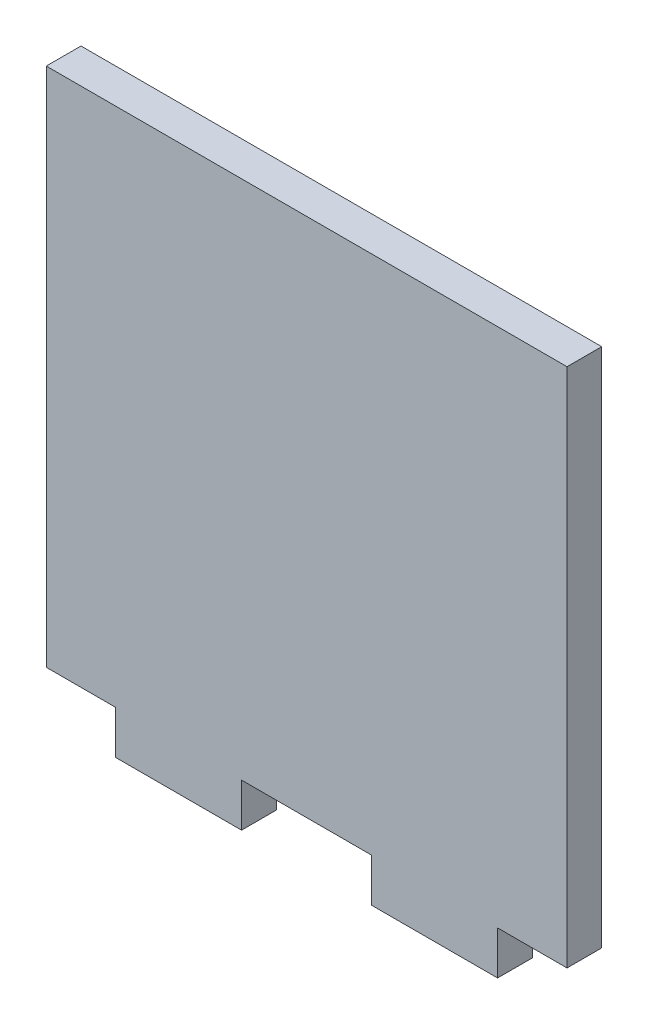
ISO-10303-21;
HEADER;
FILE_DESCRIPTION(('STEP AP214'),'2;1');
FILE_NAME('part.step','',(''),(''),'','','');
FILE_SCHEMA(('AUTOMOTIVE_DESIGN { 1 0 10303 214 1 1 1 1 }'));
ENDSEC;
DATA;
#1=APPLICATION_CONTEXT('core data for automotive mechanical design processes');
#2=APPLICATION_PROTOCOL_DEFINITION('international standard','automotive_design',2000,#1);
#3=PRODUCT_CONTEXT('',#1,'mechanical');
#4=PRODUCT('Part','Part','',(#3));
#5=PRODUCT_RELATED_PRODUCT_CATEGORY('part','',(#4));
#6=PRODUCT_DEFINITION_FORMATION('','',#4);
#7=PRODUCT_DEFINITION_CONTEXT('part definition',#1,'design');
#8=PRODUCT_DEFINITION('design','',#6,#7);
#9=PRODUCT_DEFINITION_SHAPE('','',#8);
#10=(LENGTH_UNIT() NAMED_UNIT(*) SI_UNIT(.MILLI.,.METRE.));
#11=(NAMED_UNIT(*) PLANE_ANGLE_UNIT() SI_UNIT($,.RADIAN.));
#12=(NAMED_UNIT(*) SI_UNIT($,.STERADIAN.) SOLID_ANGLE_UNIT());
#13=UNCERTAINTY_MEASURE_WITH_UNIT(LENGTH_MEASURE(1.E-05),#10,'distance_accuracy_value','');
#14=(GEOMETRIC_REPRESENTATION_CONTEXT(3) GLOBAL_UNCERTAINTY_ASSIGNED_CONTEXT((#13)) GLOBAL_UNIT_ASSIGNED_CONTEXT((#10,
#11,#12)) REPRESENTATION_CONTEXT('',''));
#15=CARTESIAN_POINT('',(0.,0.,0.));
#16=DIRECTION('',(0.,0.,1.));
#17=DIRECTION('',(1.,0.,0.));
#18=AXIS2_PLACEMENT_3D('',#15,#16,#17);
#19=CARTESIAN_POINT('',(0.,0.,0.));
#20=DIRECTION('',(0.,-1.,0.));
#21=DIRECTION('',(0.,0.,-1.));
#22=AXIS2_PLACEMENT_3D('',#19,#20,#21);
#23=PLANE('',#22);
#24=DIRECTION('',(1.,0.,0.));
#25=VECTOR('',#24,1.);
#26=CARTESIAN_POINT('',(-30.,0.,2.));
#27=LINE('',#26,#25);
#28=CARTESIAN_POINT('',(22.,0.,2.));
#29=VERTEX_POINT('',#28);
#30=CARTESIAN_POINT('',(30.,0.,2.));
#31=VERTEX_POINT('',#30);
#32=EDGE_CURVE('E175',#29,#31,#27,.T.);
#33=ORIENTED_EDGE('',*,*,#32,.F.);
#34=DIRECTION('',(0.,0.,1.));
#35=VECTOR('',#34,1.);
#36=CARTESIAN_POINT('',(22.,0.,2.));
#37=LINE('',#36,#35);
#38=CARTESIAN_POINT('',(22.,0.,-2.00000000000001));
#39=VERTEX_POINT('',#38);
#40=EDGE_CURVE('E148',#39,#29,#37,.T.);
#41=ORIENTED_EDGE('',*,*,#40,.F.);
#42=DIRECTION('',(-1.,0.,0.));
#43=VECTOR('',#42,1.);
#44=CARTESIAN_POINT('',(-30.,0.,-2.));
#45=LINE('',#44,#43);
#46=CARTESIAN_POINT('',(30.,0.,-2.));
#47=VERTEX_POINT('',#46);
#48=EDGE_CURVE('E163',#47,#39,#45,.T.);
#49=ORIENTED_EDGE('',*,*,#48,.F.);
#50=DIRECTION('',(0.,0.,-1.));
#51=VECTOR('',#50,1.);
#52=CARTESIAN_POINT('',(30.,0.,2.));
#53=LINE('',#52,#51);
#54=EDGE_CURVE('E169',#31,#47,#53,.T.);
#55=ORIENTED_EDGE('',*,*,#54,.F.);
#56=EDGE_LOOP('',(#33,#41,#49,#55));
#57=FACE_BOUND('',#56,.T.);
#58=ADVANCED_FACE('F45',(#57),#23,.T.);
#59=CARTESIAN_POINT('',(7.5,0.,-2.));
#60=VERTEX_POINT('',#59);
#61=CARTESIAN_POINT('',(-7.5,0.,-2.));
#62=VERTEX_POINT('',#61);
#63=EDGE_CURVE('E69',#60,#62,#45,.T.);
#64=ORIENTED_EDGE('',*,*,#63,.F.);
#65=DIRECTION('',(0.,0.,-1.));
#66=VECTOR('',#65,1.);
#67=CARTESIAN_POINT('',(7.5,0.,-2.));
#68=LINE('',#67,#66);
#69=CARTESIAN_POINT('',(7.5,0.,2.00000000000001));
#70=VERTEX_POINT('',#69);
#71=EDGE_CURVE('E138',#70,#60,#68,.T.);
#72=ORIENTED_EDGE('',*,*,#71,.F.);
#73=CARTESIAN_POINT('',(-7.5,0.,2.));
#74=VERTEX_POINT('',#73);
#75=EDGE_CURVE('E181',#74,#70,#27,.T.);
#76=ORIENTED_EDGE('',*,*,#75,.F.);
#77=DIRECTION('',(0.,0.,1.));
#78=VECTOR('',#77,1.);
#79=CARTESIAN_POINT('',(-7.5,0.,-2.));
#80=LINE('',#79,#78);
#81=EDGE_CURVE('E160',#62,#74,#80,.T.);
#82=ORIENTED_EDGE('',*,*,#81,.F.);
#83=EDGE_LOOP('',(#64,#72,#76,#82));
#84=FACE_BOUND('',#83,.T.);
#85=ADVANCED_FACE('F158',(#84),#23,.T.);
#86=CARTESIAN_POINT('',(30.,60.,2.));
#87=DIRECTION('',(-1.,0.,0.));
#88=DIRECTION('',(0.,0.,1.));
#89=AXIS2_PLACEMENT_3D('',#86,#87,#88);
#90=PLANE('',#89);
#91=ORIENTED_EDGE('',*,*,#54,.T.);
#92=DIRECTION('',(0.,-1.,0.));
#93=VECTOR('',#92,1.);
#94=CARTESIAN_POINT('',(30.,60.,-2.));
#95=LINE('',#94,#93);
#96=CARTESIAN_POINT('',(30.,60.,-2.));
#97=VERTEX_POINT('',#96);
#98=EDGE_CURVE('E11',#97,#47,#95,.T.);
#99=ORIENTED_EDGE('',*,*,#98,.F.);
#100=DIRECTION('',(0.,0.,-1.));
#101=VECTOR('',#100,1.);
#102=CARTESIAN_POINT('',(30.,60.,2.));
#103=LINE('',#102,#101);
#104=CARTESIAN_POINT('',(30.,60.,2.));
#105=VERTEX_POINT('',#104);
#106=EDGE_CURVE('E180',#105,#97,#103,.T.);
#107=ORIENTED_EDGE('',*,*,#106,.F.);
#108=DIRECTION('',(0.,-1.,0.));
#109=VECTOR('',#108,1.);
#110=CARTESIAN_POINT('',(30.,60.,2.));
#111=LINE('',#110,#109);
#112=EDGE_CURVE('E182',#105,#31,#111,.T.);
#113=ORIENTED_EDGE('',*,*,#112,.T.);
#114=EDGE_LOOP('',(#91,#99,#107,#113));
#115=FACE_BOUND('',#114,.T.);
#116=ADVANCED_FACE('F47',(#115),#90,.F.);
#117=CARTESIAN_POINT('',(-30.,60.,-2.));
#118=DIRECTION('',(0.,0.,1.));
#119=DIRECTION('',(1.,0.,0.));
#120=AXIS2_PLACEMENT_3D('',#117,#118,#119);
#121=PLANE('',#120);
#122=ORIENTED_EDGE('',*,*,#48,.T.);
#123=DIRECTION('',(0.,1.,0.));
#124=VECTOR('',#123,1.);
#125=CARTESIAN_POINT('',(22.,-5.,-2.00000000000001));
#126=LINE('',#125,#124);
#127=CARTESIAN_POINT('',(22.,-5.,-2.00000000000001));
#128=VERTEX_POINT('',#127);
#129=EDGE_CURVE('E242',#128,#39,#126,.T.);
#130=ORIENTED_EDGE('',*,*,#129,.F.);
#131=DIRECTION('',(1.,0.,0.));
#132=VECTOR('',#131,1.);
#133=CARTESIAN_POINT('',(22.,-5.,-2.00000000000001));
#134=LINE('',#133,#132);
#135=CARTESIAN_POINT('',(7.5,-5.,-2.));
#136=VERTEX_POINT('',#135);
#137=EDGE_CURVE('E149',#136,#128,#134,.T.);
#138=ORIENTED_EDGE('',*,*,#137,.F.);
#139=DIRECTION('',(0.,1.,0.));
#140=VECTOR('',#139,1.);
#141=CARTESIAN_POINT('',(7.5,-5.,-2.));
#142=LINE('',#141,#140);
#143=EDGE_CURVE('E141',#136,#60,#142,.T.);
#144=ORIENTED_EDGE('',*,*,#143,.T.);
#145=ORIENTED_EDGE('',*,*,#63,.T.);
#146=DIRECTION('',(0.,1.,0.));
#147=VECTOR('',#146,1.);
#148=CARTESIAN_POINT('',(-7.5,-5.,-2.));
#149=LINE('',#148,#147);
#150=CARTESIAN_POINT('',(-7.5,-5.,-2.));
#151=VERTEX_POINT('',#150);
#152=EDGE_CURVE('E222',#151,#62,#149,.T.);
#153=ORIENTED_EDGE('',*,*,#152,.F.);
#154=DIRECTION('',(1.,0.,0.));
#155=VECTOR('',#154,1.);
#156=CARTESIAN_POINT('',(-22.,-5.,-2.00000000000001));
#157=LINE('',#156,#155);
#158=CARTESIAN_POINT('',(-22.,-5.,-2.00000000000001));
#159=VERTEX_POINT('',#158);
#160=EDGE_CURVE('E266',#159,#151,#157,.T.);
#161=ORIENTED_EDGE('',*,*,#160,.F.);
#162=DIRECTION('',(0.,1.,0.));
#163=VECTOR('',#162,1.);
#164=CARTESIAN_POINT('',(-22.,-5.,-2.00000000000001));
#165=LINE('',#164,#163);
#166=CARTESIAN_POINT('',(-22.,0.,-2.00000000000001));
#167=VERTEX_POINT('',#166);
#168=EDGE_CURVE('E217',#159,#167,#165,.T.);
#169=ORIENTED_EDGE('',*,*,#168,.T.);
#170=CARTESIAN_POINT('',(-30.,0.,-2.));
#171=VERTEX_POINT('',#170);
#172=EDGE_CURVE('E164',#167,#171,#45,.T.);
#173=ORIENTED_EDGE('',*,*,#172,.T.);
#174=DIRECTION('',(0.,-1.,0.));
#175=VECTOR('',#174,1.);
#176=CARTESIAN_POINT('',(-30.,60.,-2.));
#177=LINE('',#176,#175);
#178=CARTESIAN_POINT('',(-30.,60.,-2.));
#179=VERTEX_POINT('',#178);
#180=EDGE_CURVE('E54',#179,#171,#177,.T.);
#181=ORIENTED_EDGE('',*,*,#180,.F.);
#182=DIRECTION('',(-1.,0.,0.));
#183=VECTOR('',#182,1.);
#184=CARTESIAN_POINT('',(-30.,60.,-2.));
#185=LINE('',#184,#183);
#186=EDGE_CURVE('E229',#97,#179,#185,.T.);
#187=ORIENTED_EDGE('',*,*,#186,.F.);
#188=ORIENTED_EDGE('',*,*,#98,.T.);
#189=EDGE_LOOP('',(#122,#130,#138,#144,#145,#153,#161,#169,#173,#181,#187,#188));
#190=FACE_BOUND('',#189,.T.);
#191=ADVANCED_FACE('F152',(#190),#121,.F.);
#192=CARTESIAN_POINT('',(-30.,60.,2.));
#193=DIRECTION('',(1.,0.,0.));
#194=DIRECTION('',(0.,0.,-1.));
#195=AXIS2_PLACEMENT_3D('',#192,#193,#194);
#196=PLANE('',#195);
#197=DIRECTION('',(0.,0.,1.));
#198=VECTOR('',#197,1.);
#199=CARTESIAN_POINT('',(-30.,0.,2.));
#200=LINE('',#199,#198);
#201=CARTESIAN_POINT('',(-30.,0.,2.));
#202=VERTEX_POINT('',#201);
#203=EDGE_CURVE('E168',#171,#202,#200,.T.);
#204=ORIENTED_EDGE('',*,*,#203,.T.);
#205=DIRECTION('',(0.,-1.,0.));
#206=VECTOR('',#205,1.);
#207=CARTESIAN_POINT('',(-30.,60.,2.));
#208=LINE('',#207,#206);
#209=CARTESIAN_POINT('',(-30.,60.,2.));
#210=VERTEX_POINT('',#209);
#211=EDGE_CURVE('E186',#210,#202,#208,.T.);
#212=ORIENTED_EDGE('',*,*,#211,.F.);
#213=DIRECTION('',(0.,0.,1.));
#214=VECTOR('',#213,1.);
#215=CARTESIAN_POINT('',(-30.,60.,2.));
#216=LINE('',#215,#214);
#217=EDGE_CURVE('E198',#179,#210,#216,.T.);
#218=ORIENTED_EDGE('',*,*,#217,.F.);
#219=ORIENTED_EDGE('',*,*,#180,.T.);
#220=EDGE_LOOP('',(#204,#212,#218,#219));
#221=FACE_BOUND('',#220,.T.);
#222=ADVANCED_FACE('F196',(#221),#196,.F.);
#223=CARTESIAN_POINT('',(-30.,60.,2.));
#224=DIRECTION('',(0.,0.,-1.));
#225=DIRECTION('',(-1.,0.,0.));
#226=AXIS2_PLACEMENT_3D('',#223,#224,#225);
#227=PLANE('',#226);
#228=CARTESIAN_POINT('',(-22.,0.,2.));
#229=VERTEX_POINT('',#228);
#230=EDGE_CURVE('E176',#202,#229,#27,.T.);
#231=ORIENTED_EDGE('',*,*,#230,.T.);
#232=DIRECTION('',(0.,1.,0.));
#233=VECTOR('',#232,1.);
#234=CARTESIAN_POINT('',(-22.,-5.,2.));
#235=LINE('',#234,#233);
#236=CARTESIAN_POINT('',(-22.,-5.,2.));
#237=VERTEX_POINT('',#236);
#238=EDGE_CURVE('E208',#237,#229,#235,.T.);
#239=ORIENTED_EDGE('',*,*,#238,.F.);
#240=DIRECTION('',(-1.,0.,0.));
#241=VECTOR('',#240,1.);
#242=CARTESIAN_POINT('',(-7.5,-5.,2.));
#243=LINE('',#242,#241);
#244=CARTESIAN_POINT('',(-7.5,-5.,2.));
#245=VERTEX_POINT('',#244);
#246=EDGE_CURVE('E261',#245,#237,#243,.T.);
#247=ORIENTED_EDGE('',*,*,#246,.F.);
#248=DIRECTION('',(0.,1.,0.));
#249=VECTOR('',#248,1.);
#250=CARTESIAN_POINT('',(-7.5,-5.,2.));
#251=LINE('',#250,#249);
#252=EDGE_CURVE('E271',#245,#74,#251,.T.);
#253=ORIENTED_EDGE('',*,*,#252,.T.);
#254=ORIENTED_EDGE('',*,*,#75,.T.);
#255=DIRECTION('',(0.,1.,0.));
#256=VECTOR('',#255,1.);
#257=CARTESIAN_POINT('',(7.5,-5.,2.00000000000001));
#258=LINE('',#257,#256);
#259=CARTESIAN_POINT('',(7.5,-5.,2.00000000000001));
#260=VERTEX_POINT('',#259);
#261=EDGE_CURVE('E144',#260,#70,#258,.T.);
#262=ORIENTED_EDGE('',*,*,#261,.F.);
#263=DIRECTION('',(-1.,0.,0.));
#264=VECTOR('',#263,1.);
#265=CARTESIAN_POINT('',(7.5,-5.,2.00000000000001));
#266=LINE('',#265,#264);
#267=CARTESIAN_POINT('',(22.,-5.,2.));
#268=VERTEX_POINT('',#267);
#269=EDGE_CURVE('E253',#268,#260,#266,.T.);
#270=ORIENTED_EDGE('',*,*,#269,.F.);
#271=DIRECTION('',(0.,1.,0.));
#272=VECTOR('',#271,1.);
#273=CARTESIAN_POINT('',(22.,-5.,2.));
#274=LINE('',#273,#272);
#275=EDGE_CURVE('E61',#268,#29,#274,.T.);
#276=ORIENTED_EDGE('',*,*,#275,.T.);
#277=ORIENTED_EDGE('',*,*,#32,.T.);
#278=ORIENTED_EDGE('',*,*,#112,.F.);
#279=DIRECTION('',(1.,0.,0.));
#280=VECTOR('',#279,1.);
#281=CARTESIAN_POINT('',(-30.,60.,2.));
#282=LINE('',#281,#280);
#283=EDGE_CURVE('E187',#210,#105,#282,.T.);
#284=ORIENTED_EDGE('',*,*,#283,.F.);
#285=ORIENTED_EDGE('',*,*,#211,.T.);
#286=EDGE_LOOP('',(#231,#239,#247,#253,#254,#262,#270,#276,#277,#278,#284,#285));
#287=FACE_BOUND('',#286,.T.);
#288=ADVANCED_FACE('F206',(#287),#227,.F.);
#289=CARTESIAN_POINT('',(0.,60.,0.));
#290=DIRECTION('',(0.,-1.,0.));
#291=DIRECTION('',(0.,0.,-1.));
#292=AXIS2_PLACEMENT_3D('',#289,#290,#291);
#293=PLANE('',#292);
#294=ORIENTED_EDGE('',*,*,#106,.T.);
#295=ORIENTED_EDGE('',*,*,#186,.T.);
#296=ORIENTED_EDGE('',*,*,#217,.T.);
#297=ORIENTED_EDGE('',*,*,#283,.T.);
#298=EDGE_LOOP('',(#294,#295,#296,#297));
#299=FACE_BOUND('',#298,.T.);
#300=ADVANCED_FACE('F236',(#299),#293,.F.);
#301=DIRECTION('',(0.,0.,-1.));
#302=VECTOR('',#301,1.);
#303=CARTESIAN_POINT('',(-22.,0.,2.));
#304=LINE('',#303,#302);
#305=EDGE_CURVE('E203',#229,#167,#304,.T.);
#306=ORIENTED_EDGE('',*,*,#305,.F.);
#307=ORIENTED_EDGE('',*,*,#230,.F.);
#308=ORIENTED_EDGE('',*,*,#203,.F.);
#309=ORIENTED_EDGE('',*,*,#172,.F.);
#310=EDGE_LOOP('',(#306,#307,#308,#309));
#311=FACE_BOUND('',#310,.T.);
#312=ADVANCED_FACE('F201',(#311),#23,.T.);
#313=CARTESIAN_POINT('',(-22.,-5.,2.));
#314=DIRECTION('',(1.,0.,0.));
#315=DIRECTION('',(0.,0.,-1.));
#316=AXIS2_PLACEMENT_3D('',#313,#314,#315);
#317=PLANE('',#316);
#318=ORIENTED_EDGE('',*,*,#305,.T.);
#319=ORIENTED_EDGE('',*,*,#168,.F.);
#320=DIRECTION('',(0.,0.,-1.));
#321=VECTOR('',#320,1.);
#322=CARTESIAN_POINT('',(-22.,-5.,2.));
#323=LINE('',#322,#321);
#324=EDGE_CURVE('E214',#237,#159,#323,.T.);
#325=ORIENTED_EDGE('',*,*,#324,.F.);
#326=ORIENTED_EDGE('',*,*,#238,.T.);
#327=EDGE_LOOP('',(#318,#319,#325,#326));
#328=FACE_BOUND('',#327,.T.);
#329=ADVANCED_FACE('F211',(#328),#317,.F.);
#330=CARTESIAN_POINT('',(-7.5,-5.,-2.));
#331=DIRECTION('',(-1.,0.,0.));
#332=DIRECTION('',(0.,0.,1.));
#333=AXIS2_PLACEMENT_3D('',#330,#331,#332);
#334=PLANE('',#333);
#335=ORIENTED_EDGE('',*,*,#81,.T.);
#336=ORIENTED_EDGE('',*,*,#252,.F.);
#337=DIRECTION('',(0.,0.,1.));
#338=VECTOR('',#337,1.);
#339=CARTESIAN_POINT('',(-7.5,-5.,-2.));
#340=LINE('',#339,#338);
#341=EDGE_CURVE('E269',#151,#245,#340,.T.);
#342=ORIENTED_EDGE('',*,*,#341,.F.);
#343=ORIENTED_EDGE('',*,*,#152,.T.);
#344=EDGE_LOOP('',(#335,#336,#342,#343));
#345=FACE_BOUND('',#344,.T.);
#346=ADVANCED_FACE('F280',(#345),#334,.F.);
#347=CARTESIAN_POINT('',(0.,-5.,0.));
#348=DIRECTION('',(0.,-1.,0.));
#349=DIRECTION('',(0.,0.,-1.));
#350=AXIS2_PLACEMENT_3D('',#347,#348,#349);
#351=PLANE('',#350);
#352=ORIENTED_EDGE('',*,*,#246,.T.);
#353=ORIENTED_EDGE('',*,*,#324,.T.);
#354=ORIENTED_EDGE('',*,*,#160,.T.);
#355=ORIENTED_EDGE('',*,*,#341,.T.);
#356=EDGE_LOOP('',(#352,#353,#354,#355));
#357=FACE_BOUND('',#356,.T.);
#358=ADVANCED_FACE('F284',(#357),#351,.T.);
#359=CARTESIAN_POINT('',(22.,-5.,2.));
#360=DIRECTION('',(-1.,0.,0.));
#361=DIRECTION('',(0.,0.,1.));
#362=AXIS2_PLACEMENT_3D('',#359,#360,#361);
#363=PLANE('',#362);
#364=ORIENTED_EDGE('',*,*,#40,.T.);
#365=ORIENTED_EDGE('',*,*,#275,.F.);
#366=DIRECTION('',(0.,0.,1.));
#367=VECTOR('',#366,1.);
#368=CARTESIAN_POINT('',(22.,-5.,2.));
#369=LINE('',#368,#367);
#370=EDGE_CURVE('E256',#128,#268,#369,.T.);
#371=ORIENTED_EDGE('',*,*,#370,.F.);
#372=ORIENTED_EDGE('',*,*,#129,.T.);
#373=EDGE_LOOP('',(#364,#365,#371,#372));
#374=FACE_BOUND('',#373,.T.);
#375=ADVANCED_FACE('F291',(#374),#363,.F.);
#376=CARTESIAN_POINT('',(7.5,-5.,-2.));
#377=DIRECTION('',(1.,0.,0.));
#378=DIRECTION('',(0.,0.,-1.));
#379=AXIS2_PLACEMENT_3D('',#376,#377,#378);
#380=PLANE('',#379);
#381=ORIENTED_EDGE('',*,*,#71,.T.);
#382=ORIENTED_EDGE('',*,*,#143,.F.);
#383=DIRECTION('',(0.,0.,-1.));
#384=VECTOR('',#383,1.);
#385=CARTESIAN_POINT('',(7.5,-5.,-2.));
#386=LINE('',#385,#384);
#387=EDGE_CURVE('E156',#260,#136,#386,.T.);
#388=ORIENTED_EDGE('',*,*,#387,.F.);
#389=ORIENTED_EDGE('',*,*,#261,.T.);
#390=EDGE_LOOP('',(#381,#382,#388,#389));
#391=FACE_BOUND('',#390,.T.);
#392=ADVANCED_FACE('F139',(#391),#380,.F.);
#393=CARTESIAN_POINT('',(0.,-5.,0.));
#394=DIRECTION('',(0.,1.,0.));
#395=DIRECTION('',(0.,0.,1.));
#396=AXIS2_PLACEMENT_3D('',#393,#394,#395);
#397=PLANE('',#396);
#398=ORIENTED_EDGE('',*,*,#137,.T.);
#399=ORIENTED_EDGE('',*,*,#370,.T.);
#400=ORIENTED_EDGE('',*,*,#269,.T.);
#401=ORIENTED_EDGE('',*,*,#387,.T.);
#402=EDGE_LOOP('',(#398,#399,#400,#401));
#403=FACE_BOUND('',#402,.T.);
#404=ADVANCED_FACE('F290',(#403),#397,.F.);
#405=CLOSED_SHELL('',(#58,#85,#116,#191,#222,#288,#300,#312,#329,#346,#358,#375,#392,#404));
#406=MANIFOLD_SOLID_BREP('B2',#405);
#407=ADVANCED_BREP_SHAPE_REPRESENTATION('',(#18,#406),#14);
#408=SHAPE_DEFINITION_REPRESENTATION(#9,#407);
ENDSEC;
END-ISO-10303-21;
